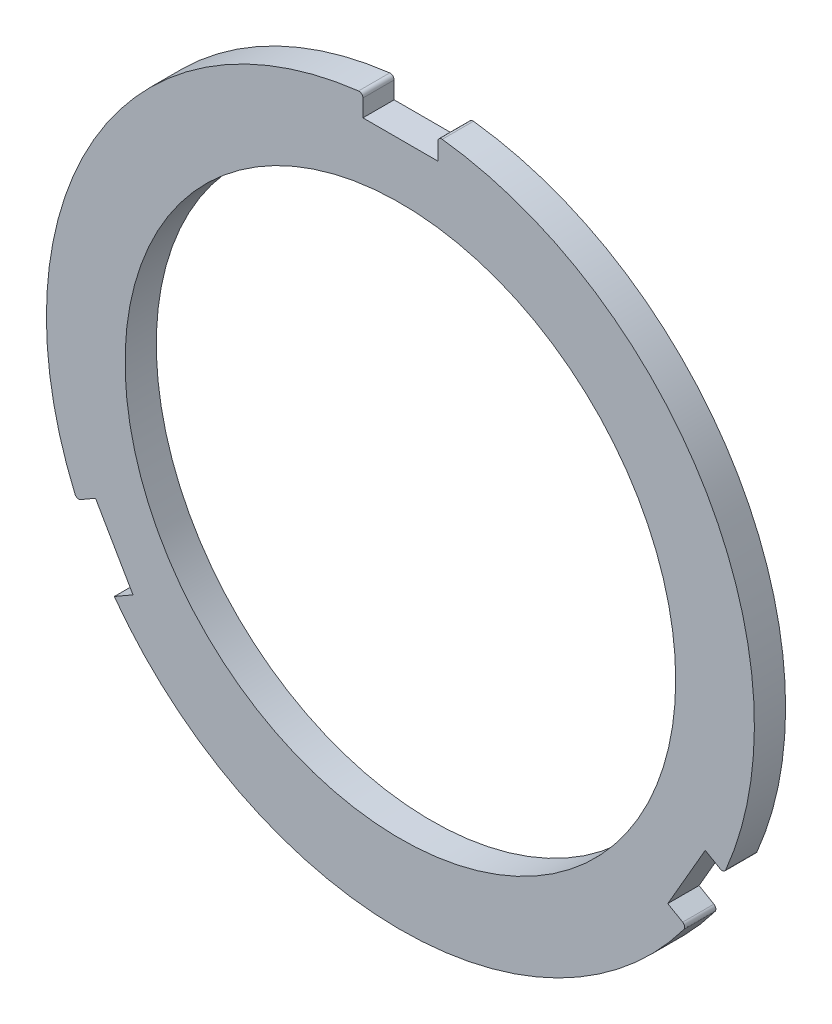
ISO-10303-21;
HEADER;
FILE_DESCRIPTION(('STEP AP214'),'2;1');
FILE_NAME('part.step','',(''),(''),'','','');
FILE_SCHEMA(('AUTOMOTIVE_DESIGN { 1 0 10303 214 1 1 1 1 }'));
ENDSEC;
DATA;
#1=APPLICATION_CONTEXT('core data for automotive mechanical design processes');
#2=APPLICATION_PROTOCOL_DEFINITION('international standard','automotive_design',2000,#1);
#3=PRODUCT_CONTEXT('',#1,'mechanical');
#4=PRODUCT('Part','Part','',(#3));
#5=PRODUCT_RELATED_PRODUCT_CATEGORY('part','',(#4));
#6=PRODUCT_DEFINITION_FORMATION('','',#4);
#7=PRODUCT_DEFINITION_CONTEXT('part definition',#1,'design');
#8=PRODUCT_DEFINITION('design','',#6,#7);
#9=PRODUCT_DEFINITION_SHAPE('','',#8);
#10=(LENGTH_UNIT() NAMED_UNIT(*) SI_UNIT(.MILLI.,.METRE.));
#11=(NAMED_UNIT(*) PLANE_ANGLE_UNIT() SI_UNIT($,.RADIAN.));
#12=(NAMED_UNIT(*) SI_UNIT($,.STERADIAN.) SOLID_ANGLE_UNIT());
#13=UNCERTAINTY_MEASURE_WITH_UNIT(LENGTH_MEASURE(1.E-05),#10,'distance_accuracy_value','');
#14=(GEOMETRIC_REPRESENTATION_CONTEXT(3) GLOBAL_UNCERTAINTY_ASSIGNED_CONTEXT((#13)) GLOBAL_UNIT_ASSIGNED_CONTEXT((#10,
#11,#12)) REPRESENTATION_CONTEXT('',''));
#15=CARTESIAN_POINT('',(0.,0.,0.));
#16=DIRECTION('',(0.,0.,1.));
#17=DIRECTION('',(1.,0.,0.));
#18=AXIS2_PLACEMENT_3D('',#15,#16,#17);
#19=CARTESIAN_POINT('',(0.,0.,1.984375));
#20=DIRECTION('',(0.,0.,1.));
#21=DIRECTION('',(1.,0.,0.));
#22=AXIS2_PLACEMENT_3D('',#19,#20,#21);
#23=PLANE('',#22);
#24=CARTESIAN_POINT('',(0.,0.,1.984375));
#25=DIRECTION('',(0.,0.,1.));
#26=DIRECTION('',(1.,0.,0.));
#27=AXIS2_PLACEMENT_3D('',#24,#25,#26);
#28=CIRCLE('',#27,22.4999999999998);
#29=CARTESIAN_POINT('',(-2.66081460674157,22.3421141709674,1.984375));
#30=VERTEX_POINT('',#29);
#31=CARTESIAN_POINT('',(-20.6792457496807,-8.86672404128515,1.984375));
#32=VERTEX_POINT('',#31);
#33=EDGE_CURVE('E165',#30,#32,#28,.T.);
#34=ORIENTED_EDGE('',*,*,#33,.T.);
#35=CARTESIAN_POINT('',(-20.4494763524621,-8.76820488527087,1.984375));
#36=DIRECTION('',(0.,0.,1.));
#37=DIRECTION('',(1.,0.,0.));
#38=AXIS2_PLACEMENT_3D('',#35,#36,#37);
#39=CIRCLE('',#38,0.25);
#40=CARTESIAN_POINT('',(-20.324476352462,-8.98471123621694,1.984375));
#41=VERTEX_POINT('',#40);
#42=EDGE_CURVE('E393',#32,#41,#39,.T.);
#43=ORIENTED_EDGE('',*,*,#42,.T.);
#44=DIRECTION('',(0.866025403784272,0.500000000000289,0.));
#45=VECTOR('',#44,1.);
#46=CARTESIAN_POINT('',(-19.3771584794732,-8.4377770072383,1.984375));
#47=LINE('',#46,#45);
#48=CARTESIAN_POINT('',(-19.3771584794732,-8.4377770072383,1.984375));
#49=VERTEX_POINT('',#48);
#50=EDGE_CURVE('E342',#41,#49,#47,.T.);
#51=ORIENTED_EDGE('',*,*,#50,.T.);
#52=DIRECTION('',(0.500000000000002,-0.866025403784438,0.));
#53=VECTOR('',#52,1.);
#54=CARTESIAN_POINT('',(-18.1865334794732,-10.5,1.984375));
#55=LINE('',#54,#53);
#56=CARTESIAN_POINT('',(-16.9959084794732,-12.5622229927617,1.984375));
#57=VERTEX_POINT('',#56);
#58=EDGE_CURVE('E340',#49,#57,#55,.T.);
#59=ORIENTED_EDGE('',*,*,#58,.T.);
#60=DIRECTION('',(-0.866025403784272,-0.500000000000289,0.));
#61=VECTOR('',#60,1.);
#62=CARTESIAN_POINT('',(-18.1855133234149,-13.2490416696412,1.984375));
#63=LINE('',#62,#61);
#64=CARTESIAN_POINT('',(-18.185513323415,-13.2490416696413,1.984375));
#65=VERTEX_POINT('',#64);
#66=EDGE_CURVE('E303',#57,#65,#63,.T.);
#67=ORIENTED_EDGE('',*,*,#66,.T.);
#68=CARTESIAN_POINT('',(0.,0.,1.984375));
#69=DIRECTION('',(0.,0.,1.));
#70=DIRECTION('',(1.,0.,0.));
#71=AXIS2_PLACEMENT_3D('',#68,#69,#70);
#72=CIRCLE('',#71,22.4999999999999);
#73=CARTESIAN_POINT('',(18.0184311429393,-13.4753901296827,1.984375));
#74=VERTEX_POINT('',#73);
#75=EDGE_CURVE('E336',#65,#74,#72,.T.);
#76=ORIENTED_EDGE('',*,*,#75,.T.);
#77=CARTESIAN_POINT('',(17.8182263524622,-13.3256635726862,1.984375));
#78=DIRECTION('',(0.,0.,1.));
#79=DIRECTION('',(1.,0.,0.));
#80=AXIS2_PLACEMENT_3D('',#77,#78,#79);
#81=CIRCLE('',#80,0.25);
#82=CARTESIAN_POINT('',(17.9432263524622,-13.1091572217401,1.984375));
#83=VERTEX_POINT('',#82);
#84=EDGE_CURVE('E383',#74,#83,#81,.T.);
#85=ORIENTED_EDGE('',*,*,#84,.T.);
#86=DIRECTION('',(-0.8660254037844,0.500000000000067,0.));
#87=VECTOR('',#86,1.);
#88=CARTESIAN_POINT('',(16.9959084794732,-12.5622229927617,1.984375));
#89=LINE('',#88,#87);
#90=CARTESIAN_POINT('',(16.9959084794732,-12.5622229927617,1.984375));
#91=VERTEX_POINT('',#90);
#92=EDGE_CURVE('E334',#83,#91,#89,.T.);
#93=ORIENTED_EDGE('',*,*,#92,.T.);
#94=DIRECTION('',(0.5,0.866025403784439,0.));
#95=VECTOR('',#94,1.);
#96=CARTESIAN_POINT('',(18.1865334794732,-10.5,1.984375));
#97=LINE('',#96,#95);
#98=CARTESIAN_POINT('',(19.3771584794732,-8.4377770072383,1.984375));
#99=VERTEX_POINT('',#98);
#100=EDGE_CURVE('E332',#91,#99,#97,.T.);
#101=ORIENTED_EDGE('',*,*,#100,.T.);
#102=DIRECTION('',(0.8660254037844,-0.500000000000067,0.));
#103=VECTOR('',#102,1.);
#104=CARTESIAN_POINT('',(20.5667633234153,-9.12459568411768,1.984375));
#105=LINE('',#104,#103);
#106=CARTESIAN_POINT('',(20.3244763524623,-8.98471123621679,1.984375));
#107=VERTEX_POINT('',#106);
#108=EDGE_CURVE('E279',#99,#107,#105,.T.);
#109=ORIENTED_EDGE('',*,*,#108,.T.);
#110=CARTESIAN_POINT('',(20.4494763524623,-8.76820488527069,1.984375));
#111=DIRECTION('',(0.,0.,1.));
#112=DIRECTION('',(1.,0.,0.));
#113=AXIS2_PLACEMENT_3D('',#110,#111,#112);
#114=CIRCLE('',#113,0.25);
#115=CARTESIAN_POINT('',(20.679245749681,-8.86672404128497,1.984375));
#116=VERTEX_POINT('',#115);
#117=EDGE_CURVE('E386',#107,#116,#114,.T.);
#118=ORIENTED_EDGE('',*,*,#117,.T.);
#119=CARTESIAN_POINT('',(0.,0.,1.984375));
#120=DIRECTION('',(0.,0.,1.));
#121=DIRECTION('',(1.,0.,0.));
#122=AXIS2_PLACEMENT_3D('',#119,#120,#121);
#123=CIRCLE('',#122,22.5);
#124=CARTESIAN_POINT('',(2.66081460674157,22.3421141709676,1.984375));
#125=VERTEX_POINT('',#124);
#126=EDGE_CURVE('E329',#116,#125,#123,.T.);
#127=ORIENTED_EDGE('',*,*,#126,.T.);
#128=CARTESIAN_POINT('',(2.63125,22.0938684579568,1.984375));
#129=DIRECTION('',(0.,0.,1.));
#130=DIRECTION('',(1.,0.,0.));
#131=AXIS2_PLACEMENT_3D('',#128,#129,#130);
#132=CIRCLE('',#131,0.25);
#133=CARTESIAN_POINT('',(2.38125,22.0938684579568,1.984375));
#134=VERTEX_POINT('',#133);
#135=EDGE_CURVE('E46',#125,#134,#132,.T.);
#136=ORIENTED_EDGE('',*,*,#135,.T.);
#137=DIRECTION('',(0.,-1.,0.));
#138=VECTOR('',#137,1.);
#139=CARTESIAN_POINT('',(2.38125,21.,1.984375));
#140=LINE('',#139,#138);
#141=CARTESIAN_POINT('',(2.38125,21.,1.984375));
#142=VERTEX_POINT('',#141);
#143=EDGE_CURVE('E171',#134,#142,#140,.T.);
#144=ORIENTED_EDGE('',*,*,#143,.T.);
#145=DIRECTION('',(-1.,0.,0.));
#146=VECTOR('',#145,1.);
#147=CARTESIAN_POINT('',(-2.38125,21.,1.984375));
#148=LINE('',#147,#146);
#149=CARTESIAN_POINT('',(-2.38125,21.,1.984375));
#150=VERTEX_POINT('',#149);
#151=EDGE_CURVE('E166',#142,#150,#148,.T.);
#152=ORIENTED_EDGE('',*,*,#151,.T.);
#153=DIRECTION('',(0.,1.,0.));
#154=VECTOR('',#153,1.);
#155=CARTESIAN_POINT('',(-2.38125,22.3736373537586,1.984375));
#156=LINE('',#155,#154);
#157=CARTESIAN_POINT('',(-2.38125,22.0938684579567,1.984375));
#158=VERTEX_POINT('',#157);
#159=EDGE_CURVE('E157',#150,#158,#156,.T.);
#160=ORIENTED_EDGE('',*,*,#159,.T.);
#161=CARTESIAN_POINT('',(-2.63125,22.0938684579567,1.984375));
#162=DIRECTION('',(0.,0.,1.));
#163=DIRECTION('',(1.,0.,0.));
#164=AXIS2_PLACEMENT_3D('',#161,#162,#163);
#165=CIRCLE('',#164,0.25);
#166=EDGE_CURVE('E384',#158,#30,#165,.T.);
#167=ORIENTED_EDGE('',*,*,#166,.T.);
#168=EDGE_LOOP('',(#34,#43,#51,#59,#67,#76,#85,#93,#101,#109,#118,#127,#136,#144,#152,#160,#167));
#169=FACE_BOUND('',#168,.T.);
#170=CARTESIAN_POINT('',(0.,0.,1.984375));
#171=DIRECTION('',(0.,0.,1.));
#172=DIRECTION('',(1.,0.,0.));
#173=AXIS2_PLACEMENT_3D('',#170,#171,#172);
#174=CIRCLE('',#173,17.5);
#175=CARTESIAN_POINT('',(17.5,0.,1.984375));
#176=VERTEX_POINT('',#175);
#177=EDGE_CURVE('E327',#176,#176,#174,.T.);
#178=ORIENTED_EDGE('',*,*,#177,.F.);
#179=EDGE_LOOP('',(#178));
#180=FACE_BOUND('',#179,.T.);
#181=ADVANCED_FACE('F31',(#169,#180),#23,.T.);
#182=CARTESIAN_POINT('',(0.,0.,0.));
#183=DIRECTION('',(0.,0.,1.));
#184=DIRECTION('',(1.,0.,0.));
#185=AXIS2_PLACEMENT_3D('',#182,#183,#184);
#186=PLANE('',#185);
#187=CARTESIAN_POINT('',(0.,0.,0.));
#188=DIRECTION('',(0.,0.,1.));
#189=DIRECTION('',(1.,0.,0.));
#190=AXIS2_PLACEMENT_3D('',#187,#188,#189);
#191=CIRCLE('',#190,22.4999999999999);
#192=CARTESIAN_POINT('',(-18.0362455188442,-13.4515369970858,0.));
#193=VERTEX_POINT('',#192);
#194=CARTESIAN_POINT('',(18.0184311429393,-13.4753901296827,0.));
#195=VERTEX_POINT('',#194);
#196=EDGE_CURVE('E311',#193,#195,#191,.T.);
#197=ORIENTED_EDGE('',*,*,#196,.F.);
#198=DIRECTION('',(-0.866025403784272,-0.500000000000289,0.));
#199=VECTOR('',#198,1.);
#200=CARTESIAN_POINT('',(1.31562499999726,-2.2787293437013,0.));
#201=LINE('',#200,#199);
#202=CARTESIAN_POINT('',(-16.8709084794732,-12.7787293437078,0.));
#203=VERTEX_POINT('',#202);
#204=EDGE_CURVE('E309',#193,#203,#201,.F.);
#205=ORIENTED_EDGE('',*,*,#204,.T.);
#206=DIRECTION('',(0.499999999999999,-0.866025403784439,0.));
#207=VECTOR('',#206,1.);
#208=CARTESIAN_POINT('',(-16.9959084794732,-12.5622229927617,0.));
#209=LINE('',#208,#207);
#210=CARTESIAN_POINT('',(-19.3771584794732,-8.4377770072383,0.));
#211=VERTEX_POINT('',#210);
#212=EDGE_CURVE('E316',#211,#203,#209,.T.);
#213=ORIENTED_EDGE('',*,*,#212,.F.);
#214=DIRECTION('',(0.866025403784272,0.500000000000289,0.));
#215=VECTOR('',#214,1.);
#216=CARTESIAN_POINT('',(-19.3771584794732,-8.4377770072383,0.));
#217=LINE('',#216,#215);
#218=CARTESIAN_POINT('',(-20.324476352462,-8.98471123621694,0.));
#219=VERTEX_POINT('',#218);
#220=EDGE_CURVE('E318',#219,#211,#217,.T.);
#221=ORIENTED_EDGE('',*,*,#220,.F.);
#222=CARTESIAN_POINT('',(-20.4494763524621,-8.76820488527087,0.));
#223=DIRECTION('',(0.,0.,1.));
#224=DIRECTION('',(1.,0.,0.));
#225=AXIS2_PLACEMENT_3D('',#222,#223,#224);
#226=CIRCLE('',#225,0.25);
#227=CARTESIAN_POINT('',(-20.6792457496807,-8.86672404128515,0.));
#228=VERTEX_POINT('',#227);
#229=EDGE_CURVE('E418',#219,#228,#226,.F.);
#230=ORIENTED_EDGE('',*,*,#229,.T.);
#231=CARTESIAN_POINT('',(0.,0.,0.));
#232=DIRECTION('',(0.,0.,1.));
#233=DIRECTION('',(1.,0.,0.));
#234=AXIS2_PLACEMENT_3D('',#231,#232,#233);
#235=CIRCLE('',#234,22.4999999999998);
#236=CARTESIAN_POINT('',(-2.66081460674157,22.3421141709674,0.));
#237=VERTEX_POINT('',#236);
#238=EDGE_CURVE('E322',#237,#228,#235,.T.);
#239=ORIENTED_EDGE('',*,*,#238,.F.);
#240=CARTESIAN_POINT('',(-2.63125,22.0938684579567,0.));
#241=DIRECTION('',(0.,0.,1.));
#242=DIRECTION('',(1.,0.,0.));
#243=AXIS2_PLACEMENT_3D('',#240,#241,#242);
#244=CIRCLE('',#243,0.25);
#245=CARTESIAN_POINT('',(-2.38125,22.0938684579567,0.));
#246=VERTEX_POINT('',#245);
#247=EDGE_CURVE('E199',#237,#246,#244,.F.);
#248=ORIENTED_EDGE('',*,*,#247,.T.);
#249=DIRECTION('',(0.,1.,0.));
#250=VECTOR('',#249,1.);
#251=CARTESIAN_POINT('',(-2.38125,22.3736373537586,0.));
#252=LINE('',#251,#250);
#253=CARTESIAN_POINT('',(-2.38125,21.,0.));
#254=VERTEX_POINT('',#253);
#255=EDGE_CURVE('E325',#254,#246,#252,.T.);
#256=ORIENTED_EDGE('',*,*,#255,.F.);
#257=DIRECTION('',(-1.,0.,0.));
#258=VECTOR('',#257,1.);
#259=CARTESIAN_POINT('',(0.,21.,0.));
#260=LINE('',#259,#258);
#261=CARTESIAN_POINT('',(2.38125,21.,0.));
#262=VERTEX_POINT('',#261);
#263=EDGE_CURVE('E175',#262,#254,#260,.T.);
#264=ORIENTED_EDGE('',*,*,#263,.F.);
#265=DIRECTION('',(0.,-1.,0.));
#266=VECTOR('',#265,1.);
#267=CARTESIAN_POINT('',(2.38125,21.,0.));
#268=LINE('',#267,#266);
#269=CARTESIAN_POINT('',(2.38125,22.0938684579568,0.));
#270=VERTEX_POINT('',#269);
#271=EDGE_CURVE('E288',#270,#262,#268,.T.);
#272=ORIENTED_EDGE('',*,*,#271,.F.);
#273=CARTESIAN_POINT('',(2.63125,22.0938684579568,0.));
#274=DIRECTION('',(0.,0.,1.));
#275=DIRECTION('',(1.,0.,0.));
#276=AXIS2_PLACEMENT_3D('',#273,#274,#275);
#277=CIRCLE('',#276,0.25);
#278=CARTESIAN_POINT('',(2.66081460674157,22.3421141709676,0.));
#279=VERTEX_POINT('',#278);
#280=EDGE_CURVE('E405',#270,#279,#277,.F.);
#281=ORIENTED_EDGE('',*,*,#280,.T.);
#282=CARTESIAN_POINT('',(0.,0.,0.));
#283=DIRECTION('',(0.,0.,1.));
#284=DIRECTION('',(1.,0.,0.));
#285=AXIS2_PLACEMENT_3D('',#282,#283,#284);
#286=CIRCLE('',#285,22.5);
#287=CARTESIAN_POINT('',(20.679245749681,-8.86672404128497,0.));
#288=VERTEX_POINT('',#287);
#289=EDGE_CURVE('E286',#288,#279,#286,.T.);
#290=ORIENTED_EDGE('',*,*,#289,.F.);
#291=CARTESIAN_POINT('',(20.4494763524623,-8.76820488527069,0.));
#292=DIRECTION('',(0.,0.,1.));
#293=DIRECTION('',(1.,0.,0.));
#294=AXIS2_PLACEMENT_3D('',#291,#292,#293);
#295=CIRCLE('',#294,0.25);
#296=CARTESIAN_POINT('',(20.3244763524623,-8.98471123621679,0.));
#297=VERTEX_POINT('',#296);
#298=EDGE_CURVE('E285',#288,#297,#295,.F.);
#299=ORIENTED_EDGE('',*,*,#298,.T.);
#300=DIRECTION('',(0.8660254037844,-0.500000000000067,0.));
#301=VECTOR('',#300,1.);
#302=CARTESIAN_POINT('',(20.5667633234153,-9.12459568411768,0.));
#303=LINE('',#302,#301);
#304=CARTESIAN_POINT('',(19.3771584794732,-8.4377770072383,0.));
#305=VERTEX_POINT('',#304);
#306=EDGE_CURVE('E273',#305,#297,#303,.T.);
#307=ORIENTED_EDGE('',*,*,#306,.F.);
#308=DIRECTION('',(0.500000000000001,0.866025403784438,0.));
#309=VECTOR('',#308,1.);
#310=CARTESIAN_POINT('',(19.3771584794732,-8.4377770072383,0.));
#311=LINE('',#310,#309);
#312=CARTESIAN_POINT('',(16.9959084794732,-12.5622229927617,0.));
#313=VERTEX_POINT('',#312);
#314=EDGE_CURVE('E264',#313,#305,#311,.T.);
#315=ORIENTED_EDGE('',*,*,#314,.F.);
#316=DIRECTION('',(-0.8660254037844,0.500000000000067,0.));
#317=VECTOR('',#316,1.);
#318=CARTESIAN_POINT('',(16.9959084794732,-12.5622229927617,0.));
#319=LINE('',#318,#317);
#320=CARTESIAN_POINT('',(17.9432263524622,-13.1091572217401,0.));
#321=VERTEX_POINT('',#320);
#322=EDGE_CURVE('E274',#321,#313,#319,.T.);
#323=ORIENTED_EDGE('',*,*,#322,.F.);
#324=CARTESIAN_POINT('',(17.8182263524622,-13.3256635726862,0.));
#325=DIRECTION('',(0.,0.,1.));
#326=DIRECTION('',(1.,0.,0.));
#327=AXIS2_PLACEMENT_3D('',#324,#325,#326);
#328=CIRCLE('',#327,0.25);
#329=EDGE_CURVE('E315',#321,#195,#328,.F.);
#330=ORIENTED_EDGE('',*,*,#329,.T.);
#331=EDGE_LOOP('',(#197,#205,#213,#221,#230,#239,#248,#256,#264,#272,#281,#290,#299,#307,#315,
#323,#330));
#332=FACE_BOUND('',#331,.T.);
#333=CARTESIAN_POINT('',(0.,0.,0.));
#334=DIRECTION('',(0.,0.,1.));
#335=DIRECTION('',(1.,0.,0.));
#336=AXIS2_PLACEMENT_3D('',#333,#334,#335);
#337=CIRCLE('',#336,17.5);
#338=CARTESIAN_POINT('',(17.5,0.,0.));
#339=VERTEX_POINT('',#338);
#340=EDGE_CURVE('E345',#339,#339,#337,.T.);
#341=ORIENTED_EDGE('',*,*,#340,.T.);
#342=EDGE_LOOP('',(#341));
#343=FACE_BOUND('',#342,.T.);
#344=ADVANCED_FACE('F229',(#332,#343),#186,.F.);
#345=CARTESIAN_POINT('',(-2.38125,22.3736373537586,1.984375));
#346=DIRECTION('',(-1.,0.,0.));
#347=DIRECTION('',(0.,-1.,0.));
#348=AXIS2_PLACEMENT_3D('',#345,#346,#347);
#349=PLANE('',#348);
#350=ORIENTED_EDGE('',*,*,#255,.T.);
#351=DIRECTION('',(0.,0.,-1.));
#352=VECTOR('',#351,1.);
#353=CARTESIAN_POINT('',(-2.38125,22.0938684579567,1.984375));
#354=LINE('',#353,#352);
#355=EDGE_CURVE('E39',#246,#158,#354,.F.);
#356=ORIENTED_EDGE('',*,*,#355,.T.);
#357=ORIENTED_EDGE('',*,*,#159,.F.);
#358=DIRECTION('',(0.,0.,-1.));
#359=VECTOR('',#358,1.);
#360=CARTESIAN_POINT('',(-2.38125,21.,1.984375));
#361=LINE('',#360,#359);
#362=EDGE_CURVE('E162',#150,#254,#361,.T.);
#363=ORIENTED_EDGE('',*,*,#362,.T.);
#364=EDGE_LOOP('',(#350,#356,#357,#363));
#365=FACE_BOUND('',#364,.T.);
#366=ADVANCED_FACE('F160',(#365),#349,.F.);
#367=CARTESIAN_POINT('',(0.,0.,1.984375));
#368=DIRECTION('',(0.,0.,-1.));
#369=DIRECTION('',(-1.,0.,0.));
#370=AXIS2_PLACEMENT_3D('',#367,#368,#369);
#371=CYLINDRICAL_SURFACE('',#370,22.4999999999998);
#372=ORIENTED_EDGE('',*,*,#238,.T.);
#373=DIRECTION('',(0.,0.,-1.));
#374=VECTOR('',#373,1.);
#375=CARTESIAN_POINT('',(-20.6792457496807,-8.86672404128515,1.984375));
#376=LINE('',#375,#374);
#377=EDGE_CURVE('E388',#228,#32,#376,.F.);
#378=ORIENTED_EDGE('',*,*,#377,.T.);
#379=ORIENTED_EDGE('',*,*,#33,.F.);
#380=DIRECTION('',(0.,0.,-1.));
#381=VECTOR('',#380,1.);
#382=CARTESIAN_POINT('',(-2.66081460674157,22.3421141709674,1.984375));
#383=LINE('',#382,#381);
#384=EDGE_CURVE('E409',#30,#237,#383,.T.);
#385=ORIENTED_EDGE('',*,*,#384,.T.);
#386=EDGE_LOOP('',(#372,#378,#379,#385));
#387=FACE_BOUND('',#386,.T.);
#388=ADVANCED_FACE('F224',(#387),#371,.T.);
#389=CARTESIAN_POINT('',(-19.3771584794732,-8.4377770072383,1.984375));
#390=DIRECTION('',(-0.500000000000289,0.866025403784272,0.));
#391=DIRECTION('',(-0.866025403784272,-0.500000000000289,0.));
#392=AXIS2_PLACEMENT_3D('',#389,#390,#391);
#393=PLANE('',#392);
#394=ORIENTED_EDGE('',*,*,#50,.F.);
#395=DIRECTION('',(0.,0.,-1.));
#396=VECTOR('',#395,1.);
#397=CARTESIAN_POINT('',(-20.324476352462,-8.98471123621694,1.984375));
#398=LINE('',#397,#396);
#399=EDGE_CURVE('E412',#41,#219,#398,.T.);
#400=ORIENTED_EDGE('',*,*,#399,.T.);
#401=ORIENTED_EDGE('',*,*,#220,.T.);
#402=DIRECTION('',(0.,0.,-1.));
#403=VECTOR('',#402,1.);
#404=CARTESIAN_POINT('',(-19.3771584794732,-8.4377770072383,1.984375));
#405=LINE('',#404,#403);
#406=EDGE_CURVE('E181',#49,#211,#405,.T.);
#407=ORIENTED_EDGE('',*,*,#406,.F.);
#408=EDGE_LOOP('',(#394,#400,#401,#407));
#409=FACE_BOUND('',#408,.T.);
#410=ADVANCED_FACE('F220',(#409),#393,.F.);
#411=CARTESIAN_POINT('',(-16.9959084794732,-12.5622229927617,1.984375));
#412=DIRECTION('',(0.866025403784439,0.499999999999999,0.));
#413=DIRECTION('',(-0.499999999999999,0.866025403784439,0.));
#414=AXIS2_PLACEMENT_3D('',#411,#412,#413);
#415=PLANE('',#414);
#416=ORIENTED_EDGE('',*,*,#212,.T.);
#417=CARTESIAN_POINT('',(-16.8709084794732,-12.7787293437078,0.25));
#418=DIRECTION('',(0.866025403784439,0.499999999999999,0.));
#419=DIRECTION('',(-0.499999999999999,0.866025403784439,0.));
#420=AXIS2_PLACEMENT_3D('',#417,#418,#419);
#421=CIRCLE('',#420,0.25);
#422=CARTESIAN_POINT('',(-16.9959084794732,-12.5622229927617,0.25));
#423=VERTEX_POINT('',#422);
#424=EDGE_CURVE('E11',#203,#423,#421,.T.);
#425=ORIENTED_EDGE('',*,*,#424,.T.);
#426=DIRECTION('',(0.,0.,-1.));
#427=VECTOR('',#426,1.);
#428=CARTESIAN_POINT('',(-16.9959084794732,-12.5622229927617,1.984375));
#429=LINE('',#428,#427);
#430=EDGE_CURVE('E187',#57,#423,#429,.T.);
#431=ORIENTED_EDGE('',*,*,#430,.F.);
#432=ORIENTED_EDGE('',*,*,#58,.F.);
#433=ORIENTED_EDGE('',*,*,#406,.T.);
#434=EDGE_LOOP('',(#416,#425,#431,#432,#433));
#435=FACE_BOUND('',#434,.T.);
#436=ADVANCED_FACE('F216',(#435),#415,.F.);
#437=CARTESIAN_POINT('',(-18.1855133234149,-13.2490416696412,1.984375));
#438=DIRECTION('',(0.500000000000289,-0.866025403784272,0.));
#439=DIRECTION('',(0.866025403784272,0.500000000000289,0.));
#440=AXIS2_PLACEMENT_3D('',#437,#438,#439);
#441=PLANE('',#440);
#442=ORIENTED_EDGE('',*,*,#430,.T.);
#443=DIRECTION('',(-0.866025403784272,-0.500000000000289,0.));
#444=VECTOR('',#443,1.);
#445=CARTESIAN_POINT('',(-18.1855133234149,-13.2490416696412,0.25));
#446=LINE('',#445,#444);
#447=CARTESIAN_POINT('',(-18.185513323415,-13.2490416696413,0.25));
#448=VERTEX_POINT('',#447);
#449=EDGE_CURVE('E180',#423,#448,#446,.T.);
#450=ORIENTED_EDGE('',*,*,#449,.T.);
#451=DIRECTION('',(0.,0.,-1.));
#452=VECTOR('',#451,1.);
#453=CARTESIAN_POINT('',(-18.185513323415,-13.2490416696413,1.984375));
#454=LINE('',#453,#452);
#455=EDGE_CURVE('E296',#65,#448,#454,.T.);
#456=ORIENTED_EDGE('',*,*,#455,.F.);
#457=ORIENTED_EDGE('',*,*,#66,.F.);
#458=EDGE_LOOP('',(#442,#450,#456,#457));
#459=FACE_BOUND('',#458,.T.);
#460=ADVANCED_FACE('F211',(#459),#441,.F.);
#461=CARTESIAN_POINT('',(0.,0.,1.984375));
#462=DIRECTION('',(0.,0.,-1.));
#463=DIRECTION('',(-1.,0.,0.));
#464=AXIS2_PLACEMENT_3D('',#461,#462,#463);
#465=CYLINDRICAL_SURFACE('',#464,22.4999999999999);
#466=ORIENTED_EDGE('',*,*,#455,.T.);
#467=CARTESIAN_POINT('',(-18.185513323415,-13.2490416696413,0.25));
#468=CARTESIAN_POINT('',(-18.1855202323044,-13.2490315541133,0.235994455527866));
#469=CARTESIAN_POINT('',(-18.1848168127078,-13.2499976840566,0.221992903641545));
#470=CARTESIAN_POINT('',(-18.1820405822646,-13.2538073867919,0.194399468475728));
#471=CARTESIAN_POINT('',(-18.1799690518296,-13.2566492041312,0.180807214560032));
#472=CARTESIAN_POINT('',(-18.1745065146163,-13.2641371018495,0.154400744047634));
#473=CARTESIAN_POINT('',(-18.1711149400374,-13.268783958642,0.1415868650049));
#474=CARTESIAN_POINT('',(-18.1631096901977,-13.2797399273198,0.117105438209584));
#475=CARTESIAN_POINT('',(-18.1584961802471,-13.2860488143559,0.105437735688388));
#476=CARTESIAN_POINT('',(-18.1481624454252,-13.3001607582367,0.083546919932035));
#477=CARTESIAN_POINT('',(-18.1424396927917,-13.307967227373,0.0733272002552948));
#478=CARTESIAN_POINT('',(-18.1300518964653,-13.3248387439699,0.0546453573431156));
#479=CARTESIAN_POINT('',(-18.1233866630733,-13.3339040447972,0.0461835887906694));
#480=CARTESIAN_POINT('',(-18.1092602845618,-13.3530833305267,0.0312096895794314));
#481=CARTESIAN_POINT('',(-18.1017949159861,-13.3632028714307,0.0247086724783724));
#482=CARTESIAN_POINT('',(-18.0863070439643,-13.3841573074193,0.0138988083847444));
#483=CARTESIAN_POINT('',(-18.0782848134225,-13.3949918519717,0.00958889608641314));
#484=CARTESIAN_POINT('',(-18.0645577871629,-13.4134946456719,0.00429381338839933));
#485=CARTESIAN_POINT('',(-18.0589410702895,-13.4210557072365,0.00268446461574791));
#486=CARTESIAN_POINT('',(-18.0476337976202,-13.4362571014835,0.00053766320873769));
#487=CARTESIAN_POINT('',(-18.0419433592342,-13.4438973049711,-1.32291613047819E-06));
#488=CARTESIAN_POINT('',(-18.0362455188444,-13.4515369970855,-1.52790425850017E-12));
#489=B_SPLINE_CURVE_WITH_KNOTS('',3,(#467,#468,#469,#470,#471,#472,#473,#474,#475,#476,#477,
#478,#479,#480,#481,#482,#483,#484,#485,#486,#487,#488),.UNSPECIFIED.,.F.,.F.,(4,2,2,2,2,2,2,2,
2,2,4),(0.,0.0419599355892728,0.0838806565218168,0.125819429093874,0.167752530852161,
0.209782338484793,0.251820617804424,0.294092876522528,0.336344562946915,0.364953985337648,
0.393522389835896),.UNSPECIFIED.);
#490=EDGE_CURVE('E192',#448,#193,#489,.T.);
#491=ORIENTED_EDGE('',*,*,#490,.T.);
#492=ORIENTED_EDGE('',*,*,#196,.T.);
#493=DIRECTION('',(0.,0.,-1.));
#494=VECTOR('',#493,1.);
#495=CARTESIAN_POINT('',(18.0184311429393,-13.4753901296827,1.984375));
#496=LINE('',#495,#494);
#497=EDGE_CURVE('E184',#195,#74,#496,.F.);
#498=ORIENTED_EDGE('',*,*,#497,.T.);
#499=ORIENTED_EDGE('',*,*,#75,.F.);
#500=EDGE_LOOP('',(#466,#491,#492,#498,#499));
#501=FACE_BOUND('',#500,.T.);
#502=ADVANCED_FACE('F205',(#501),#465,.T.);
#503=CARTESIAN_POINT('',(16.9959084794732,-12.5622229927617,1.984375));
#504=DIRECTION('',(-0.500000000000067,-0.8660254037844,0.));
#505=DIRECTION('',(0.8660254037844,-0.500000000000067,0.));
#506=AXIS2_PLACEMENT_3D('',#503,#504,#505);
#507=PLANE('',#506);
#508=ORIENTED_EDGE('',*,*,#92,.F.);
#509=DIRECTION('',(0.,0.,-1.));
#510=VECTOR('',#509,1.);
#511=CARTESIAN_POINT('',(17.9432263524622,-13.1091572217401,1.984375));
#512=LINE('',#511,#510);
#513=EDGE_CURVE('E401',#83,#321,#512,.T.);
#514=ORIENTED_EDGE('',*,*,#513,.T.);
#515=ORIENTED_EDGE('',*,*,#322,.T.);
#516=DIRECTION('',(0.,0.,-1.));
#517=VECTOR('',#516,1.);
#518=CARTESIAN_POINT('',(16.9959084794732,-12.5622229927617,1.984375));
#519=LINE('',#518,#517);
#520=EDGE_CURVE('E270',#91,#313,#519,.T.);
#521=ORIENTED_EDGE('',*,*,#520,.F.);
#522=EDGE_LOOP('',(#508,#514,#515,#521));
#523=FACE_BOUND('',#522,.T.);
#524=ADVANCED_FACE('F210',(#523),#507,.F.);
#525=CARTESIAN_POINT('',(19.3771584794732,-8.4377770072383,1.984375));
#526=DIRECTION('',(-0.866025403784438,0.500000000000001,0.));
#527=DIRECTION('',(-0.500000000000001,-0.866025403784438,0.));
#528=AXIS2_PLACEMENT_3D('',#525,#526,#527);
#529=PLANE('',#528);
#530=ORIENTED_EDGE('',*,*,#314,.T.);
#531=DIRECTION('',(0.,0.,-1.));
#532=VECTOR('',#531,1.);
#533=CARTESIAN_POINT('',(19.3771584794732,-8.4377770072383,1.984375));
#534=LINE('',#533,#532);
#535=EDGE_CURVE('E267',#99,#305,#534,.T.);
#536=ORIENTED_EDGE('',*,*,#535,.F.);
#537=ORIENTED_EDGE('',*,*,#100,.F.);
#538=ORIENTED_EDGE('',*,*,#520,.T.);
#539=EDGE_LOOP('',(#530,#536,#537,#538));
#540=FACE_BOUND('',#539,.T.);
#541=ADVANCED_FACE('F253',(#540),#529,.F.);
#542=CARTESIAN_POINT('',(20.5667633234153,-9.12459568411768,1.984375));
#543=DIRECTION('',(0.500000000000067,0.8660254037844,0.));
#544=DIRECTION('',(-0.8660254037844,0.500000000000067,0.));
#545=AXIS2_PLACEMENT_3D('',#542,#543,#544);
#546=PLANE('',#545);
#547=ORIENTED_EDGE('',*,*,#306,.T.);
#548=DIRECTION('',(0.,0.,-1.));
#549=VECTOR('',#548,1.);
#550=CARTESIAN_POINT('',(20.3244763524623,-8.98471123621679,1.984375));
#551=LINE('',#550,#549);
#552=EDGE_CURVE('E399',#297,#107,#551,.F.);
#553=ORIENTED_EDGE('',*,*,#552,.T.);
#554=ORIENTED_EDGE('',*,*,#108,.F.);
#555=ORIENTED_EDGE('',*,*,#535,.T.);
#556=EDGE_LOOP('',(#547,#553,#554,#555));
#557=FACE_BOUND('',#556,.T.);
#558=ADVANCED_FACE('F251',(#557),#546,.F.);
#559=CARTESIAN_POINT('',(0.,0.,1.984375));
#560=DIRECTION('',(0.,0.,-1.));
#561=DIRECTION('',(-1.,0.,0.));
#562=AXIS2_PLACEMENT_3D('',#559,#560,#561);
#563=CYLINDRICAL_SURFACE('',#562,22.5);
#564=ORIENTED_EDGE('',*,*,#126,.F.);
#565=DIRECTION('',(0.,0.,-1.));
#566=VECTOR('',#565,1.);
#567=CARTESIAN_POINT('',(20.679245749681,-8.86672404128497,1.984375));
#568=LINE('',#567,#566);
#569=EDGE_CURVE('E396',#116,#288,#568,.T.);
#570=ORIENTED_EDGE('',*,*,#569,.T.);
#571=ORIENTED_EDGE('',*,*,#289,.T.);
#572=DIRECTION('',(0.,0.,-1.));
#573=VECTOR('',#572,1.);
#574=CARTESIAN_POINT('',(2.66081460674157,22.3421141709676,1.984375));
#575=LINE('',#574,#573);
#576=EDGE_CURVE('E54',#279,#125,#575,.F.);
#577=ORIENTED_EDGE('',*,*,#576,.T.);
#578=EDGE_LOOP('',(#564,#570,#571,#577));
#579=FACE_BOUND('',#578,.T.);
#580=ADVANCED_FACE('F247',(#579),#563,.T.);
#581=CARTESIAN_POINT('',(2.38125,21.,1.984375));
#582=DIRECTION('',(1.,0.,0.));
#583=DIRECTION('',(0.,1.,0.));
#584=AXIS2_PLACEMENT_3D('',#581,#582,#583);
#585=PLANE('',#584);
#586=ORIENTED_EDGE('',*,*,#143,.F.);
#587=DIRECTION('',(0.,0.,-1.));
#588=VECTOR('',#587,1.);
#589=CARTESIAN_POINT('',(2.38125,22.0938684579568,1.984375));
#590=LINE('',#589,#588);
#591=EDGE_CURVE('E382',#134,#270,#590,.T.);
#592=ORIENTED_EDGE('',*,*,#591,.T.);
#593=ORIENTED_EDGE('',*,*,#271,.T.);
#594=DIRECTION('',(0.,0.,-1.));
#595=VECTOR('',#594,1.);
#596=CARTESIAN_POINT('',(2.38125,21.,1.984375));
#597=LINE('',#596,#595);
#598=EDGE_CURVE('E280',#142,#262,#597,.T.);
#599=ORIENTED_EDGE('',*,*,#598,.F.);
#600=EDGE_LOOP('',(#586,#592,#593,#599));
#601=FACE_BOUND('',#600,.T.);
#602=ADVANCED_FACE('F244',(#601),#585,.F.);
#603=CARTESIAN_POINT('',(0.,21.,1.984375));
#604=DIRECTION('',(0.,-1.,0.));
#605=DIRECTION('',(1.,0.,0.));
#606=AXIS2_PLACEMENT_3D('',#603,#604,#605);
#607=PLANE('',#606);
#608=ORIENTED_EDGE('',*,*,#263,.T.);
#609=ORIENTED_EDGE('',*,*,#362,.F.);
#610=ORIENTED_EDGE('',*,*,#151,.F.);
#611=ORIENTED_EDGE('',*,*,#598,.T.);
#612=EDGE_LOOP('',(#608,#609,#610,#611));
#613=FACE_BOUND('',#612,.T.);
#614=ADVANCED_FACE('F177',(#613),#607,.F.);
#615=CARTESIAN_POINT('',(0.,0.,1.984375));
#616=DIRECTION('',(0.,0.,-1.));
#617=DIRECTION('',(-1.,0.,0.));
#618=AXIS2_PLACEMENT_3D('',#615,#616,#617);
#619=CYLINDRICAL_SURFACE('',#618,17.5);
#620=ORIENTED_EDGE('',*,*,#177,.T.);
#621=EDGE_LOOP('',(#620));
#622=FACE_BOUND('',#621,.T.);
#623=ORIENTED_EDGE('',*,*,#340,.F.);
#624=EDGE_LOOP('',(#623));
#625=FACE_BOUND('',#624,.T.);
#626=ADVANCED_FACE('F240',(#622,#625),#619,.F.);
#627=CARTESIAN_POINT('',(-18.0605133234148,-13.4655480205873,0.25));
#628=DIRECTION('',(-0.866025403784272,-0.500000000000289,0.));
#629=DIRECTION('',(0.500000000000289,-0.866025403784272,0.));
#630=AXIS2_PLACEMENT_3D('',#627,#628,#629);
#631=CYLINDRICAL_SURFACE('',#630,0.25);
#632=ORIENTED_EDGE('',*,*,#424,.F.);
#633=ORIENTED_EDGE('',*,*,#204,.F.);
#634=ORIENTED_EDGE('',*,*,#490,.F.);
#635=ORIENTED_EDGE('',*,*,#449,.F.);
#636=EDGE_LOOP('',(#632,#633,#634,#635));
#637=FACE_BOUND('',#636,.T.);
#638=ADVANCED_FACE('F201',(#637),#631,.T.);
#639=CARTESIAN_POINT('',(-20.4494763524621,-8.76820488527087,1.984375));
#640=DIRECTION('',(0.,0.,-1.));
#641=DIRECTION('',(-1.,0.,0.));
#642=AXIS2_PLACEMENT_3D('',#639,#640,#641);
#643=CYLINDRICAL_SURFACE('',#642,0.25);
#644=ORIENTED_EDGE('',*,*,#42,.F.);
#645=ORIENTED_EDGE('',*,*,#377,.F.);
#646=ORIENTED_EDGE('',*,*,#229,.F.);
#647=ORIENTED_EDGE('',*,*,#399,.F.);
#648=EDGE_LOOP('',(#644,#645,#646,#647));
#649=FACE_BOUND('',#648,.T.);
#650=ADVANCED_FACE('F357',(#649),#643,.T.);
#651=CARTESIAN_POINT('',(20.4494763524623,-8.76820488527069,1.984375));
#652=DIRECTION('',(0.,0.,-1.));
#653=DIRECTION('',(-1.,0.,0.));
#654=AXIS2_PLACEMENT_3D('',#651,#652,#653);
#655=CYLINDRICAL_SURFACE('',#654,0.25);
#656=ORIENTED_EDGE('',*,*,#117,.F.);
#657=ORIENTED_EDGE('',*,*,#552,.F.);
#658=ORIENTED_EDGE('',*,*,#298,.F.);
#659=ORIENTED_EDGE('',*,*,#569,.F.);
#660=EDGE_LOOP('',(#656,#657,#658,#659));
#661=FACE_BOUND('',#660,.T.);
#662=ADVANCED_FACE('F361',(#661),#655,.T.);
#663=CARTESIAN_POINT('',(17.8182263524622,-13.3256635726862,1.984375));
#664=DIRECTION('',(0.,0.,-1.));
#665=DIRECTION('',(-1.,0.,0.));
#666=AXIS2_PLACEMENT_3D('',#663,#664,#665);
#667=CYLINDRICAL_SURFACE('',#666,0.25);
#668=ORIENTED_EDGE('',*,*,#84,.F.);
#669=ORIENTED_EDGE('',*,*,#497,.F.);
#670=ORIENTED_EDGE('',*,*,#329,.F.);
#671=ORIENTED_EDGE('',*,*,#513,.F.);
#672=EDGE_LOOP('',(#668,#669,#670,#671));
#673=FACE_BOUND('',#672,.T.);
#674=ADVANCED_FACE('F366',(#673),#667,.T.);
#675=CARTESIAN_POINT('',(2.63125,22.0938684579568,1.984375));
#676=DIRECTION('',(0.,0.,-1.));
#677=DIRECTION('',(-1.,0.,0.));
#678=AXIS2_PLACEMENT_3D('',#675,#676,#677);
#679=CYLINDRICAL_SURFACE('',#678,0.25);
#680=ORIENTED_EDGE('',*,*,#135,.F.);
#681=ORIENTED_EDGE('',*,*,#576,.F.);
#682=ORIENTED_EDGE('',*,*,#280,.F.);
#683=ORIENTED_EDGE('',*,*,#591,.F.);
#684=EDGE_LOOP('',(#680,#681,#682,#683));
#685=FACE_BOUND('',#684,.T.);
#686=ADVANCED_FACE('F372',(#685),#679,.T.);
#687=CARTESIAN_POINT('',(-2.63125,22.0938684579567,1.984375));
#688=DIRECTION('',(0.,0.,-1.));
#689=DIRECTION('',(-1.,0.,0.));
#690=AXIS2_PLACEMENT_3D('',#687,#688,#689);
#691=CYLINDRICAL_SURFACE('',#690,0.25);
#692=ORIENTED_EDGE('',*,*,#166,.F.);
#693=ORIENTED_EDGE('',*,*,#355,.F.);
#694=ORIENTED_EDGE('',*,*,#247,.F.);
#695=ORIENTED_EDGE('',*,*,#384,.F.);
#696=EDGE_LOOP('',(#692,#693,#694,#695));
#697=FACE_BOUND('',#696,.T.);
#698=ADVANCED_FACE('F33',(#697),#691,.T.);
#699=CLOSED_SHELL('',(#181,#344,#366,#388,#410,#436,#460,#502,#524,#541,#558,#580,#602,#614,
#626,#638,#650,#662,#674,#686,#698));
#700=MANIFOLD_SOLID_BREP('B2',#699);
#701=ADVANCED_BREP_SHAPE_REPRESENTATION('',(#18,#700),#14);
#702=SHAPE_DEFINITION_REPRESENTATION(#9,#701);
ENDSEC;
END-ISO-10303-21;
